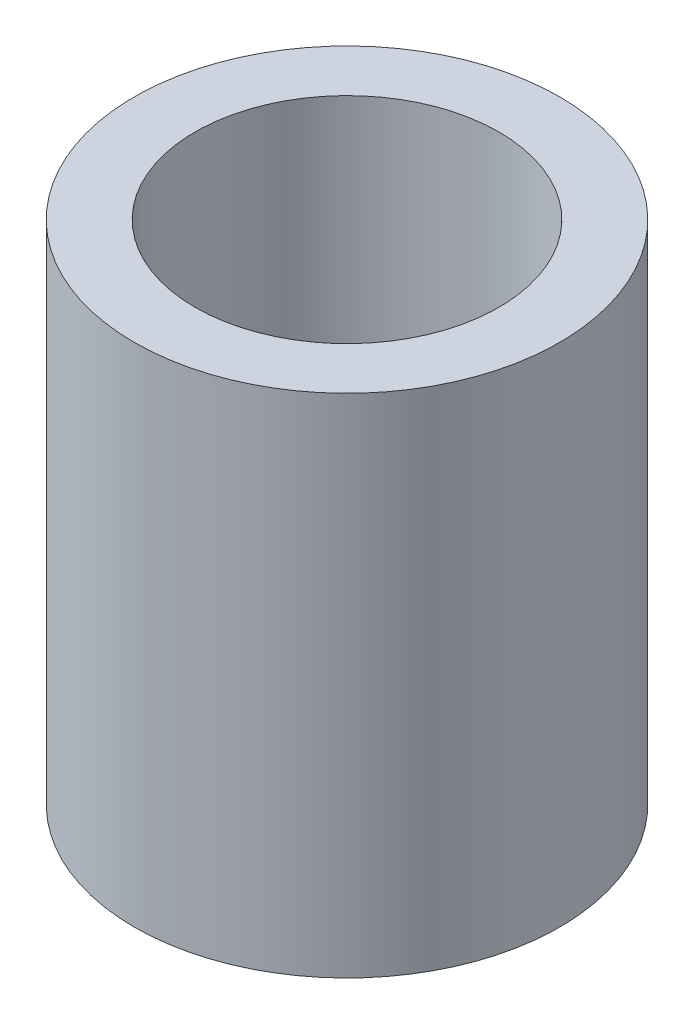
ISO-10303-21;
HEADER;
FILE_DESCRIPTION(('STEP AP214'),'2;1');
FILE_NAME('part.step','',(''),(''),'','','');
FILE_SCHEMA(('AUTOMOTIVE_DESIGN { 1 0 10303 214 1 1 1 1 }'));
ENDSEC;
DATA;
#1=APPLICATION_CONTEXT('core data for automotive mechanical design processes');
#2=APPLICATION_PROTOCOL_DEFINITION('international standard','automotive_design',2000,#1);
#3=PRODUCT_CONTEXT('',#1,'mechanical');
#4=PRODUCT('Part','Part','',(#3));
#5=PRODUCT_RELATED_PRODUCT_CATEGORY('part','',(#4));
#6=PRODUCT_DEFINITION_FORMATION('','',#4);
#7=PRODUCT_DEFINITION_CONTEXT('part definition',#1,'design');
#8=PRODUCT_DEFINITION('design','',#6,#7);
#9=PRODUCT_DEFINITION_SHAPE('','',#8);
#10=(LENGTH_UNIT() NAMED_UNIT(*) SI_UNIT(.MILLI.,.METRE.));
#11=(NAMED_UNIT(*) PLANE_ANGLE_UNIT() SI_UNIT($,.RADIAN.));
#12=(NAMED_UNIT(*) SI_UNIT($,.STERADIAN.) SOLID_ANGLE_UNIT());
#13=UNCERTAINTY_MEASURE_WITH_UNIT(LENGTH_MEASURE(1.E-05),#10,'distance_accuracy_value','');
#14=(GEOMETRIC_REPRESENTATION_CONTEXT(3) GLOBAL_UNCERTAINTY_ASSIGNED_CONTEXT((#13)) GLOBAL_UNIT_ASSIGNED_CONTEXT((#10,
#11,#12)) REPRESENTATION_CONTEXT('',''));
#15=CARTESIAN_POINT('',(0.,0.,0.));
#16=DIRECTION('',(0.,0.,1.));
#17=DIRECTION('',(1.,0.,0.));
#18=AXIS2_PLACEMENT_3D('',#15,#16,#17);
#19=CARTESIAN_POINT('',(0.,5.,0.));
#20=DIRECTION('',(0.,1.,0.));
#21=DIRECTION('',(0.,0.,1.));
#22=AXIS2_PLACEMENT_3D('',#19,#20,#21);
#23=PLANE('',#22);
#24=CARTESIAN_POINT('',(0.,5.,0.));
#25=DIRECTION('',(0.,1.,0.));
#26=DIRECTION('',(0.,0.,1.));
#27=AXIS2_PLACEMENT_3D('',#24,#25,#26);
#28=CIRCLE('',#27,2.1);
#29=CARTESIAN_POINT('',(0.,5.,2.1));
#30=VERTEX_POINT('',#29);
#31=EDGE_CURVE('E10',#30,#30,#28,.T.);
#32=ORIENTED_EDGE('',*,*,#31,.T.);
#33=EDGE_LOOP('',(#32));
#34=FACE_BOUND('',#33,.T.);
#35=CARTESIAN_POINT('',(0.,5.,0.));
#36=DIRECTION('',(0.,1.,0.));
#37=DIRECTION('',(0.,0.,1.));
#38=AXIS2_PLACEMENT_3D('',#35,#36,#37);
#39=CIRCLE('',#38,1.5);
#40=CARTESIAN_POINT('',(0.,5.,1.5));
#41=VERTEX_POINT('',#40);
#42=EDGE_CURVE('E46',#41,#41,#39,.T.);
#43=ORIENTED_EDGE('',*,*,#42,.F.);
#44=EDGE_LOOP('',(#43));
#45=FACE_BOUND('',#44,.T.);
#46=ADVANCED_FACE('F35',(#34,#45),#23,.T.);
#47=CARTESIAN_POINT('',(0.,0.,0.));
#48=DIRECTION('',(0.,1.,0.));
#49=DIRECTION('',(0.,0.,1.));
#50=AXIS2_PLACEMENT_3D('',#47,#48,#49);
#51=PLANE('',#50);
#52=CARTESIAN_POINT('',(0.,0.,0.));
#53=DIRECTION('',(0.,1.,0.));
#54=DIRECTION('',(0.,0.,1.));
#55=AXIS2_PLACEMENT_3D('',#52,#53,#54);
#56=CIRCLE('',#55,2.1);
#57=CARTESIAN_POINT('',(0.,0.,2.1));
#58=VERTEX_POINT('',#57);
#59=EDGE_CURVE('E39',#58,#58,#56,.T.);
#60=ORIENTED_EDGE('',*,*,#59,.F.);
#61=EDGE_LOOP('',(#60));
#62=FACE_BOUND('',#61,.T.);
#63=CARTESIAN_POINT('',(0.,0.,0.));
#64=DIRECTION('',(0.,1.,0.));
#65=DIRECTION('',(0.,0.,1.));
#66=AXIS2_PLACEMENT_3D('',#63,#64,#65);
#67=CIRCLE('',#66,1.5);
#68=CARTESIAN_POINT('',(0.,0.,1.5));
#69=VERTEX_POINT('',#68);
#70=EDGE_CURVE('E48',#69,#69,#67,.T.);
#71=ORIENTED_EDGE('',*,*,#70,.T.);
#72=EDGE_LOOP('',(#71));
#73=FACE_BOUND('',#72,.T.);
#74=ADVANCED_FACE('F58',(#62,#73),#51,.F.);
#75=CARTESIAN_POINT('',(0.,5.,0.));
#76=DIRECTION('',(0.,-1.,0.));
#77=DIRECTION('',(0.,0.,-1.));
#78=AXIS2_PLACEMENT_3D('',#75,#76,#77);
#79=CYLINDRICAL_SURFACE('',#78,2.1);
#80=ORIENTED_EDGE('',*,*,#31,.F.);
#81=EDGE_LOOP('',(#80));
#82=FACE_BOUND('',#81,.T.);
#83=ORIENTED_EDGE('',*,*,#59,.T.);
#84=EDGE_LOOP('',(#83));
#85=FACE_BOUND('',#84,.T.);
#86=ADVANCED_FACE('F37',(#82,#85),#79,.T.);
#87=CARTESIAN_POINT('',(0.,5.,0.));
#88=DIRECTION('',(0.,-1.,0.));
#89=DIRECTION('',(0.,0.,-1.));
#90=AXIS2_PLACEMENT_3D('',#87,#88,#89);
#91=CYLINDRICAL_SURFACE('',#90,1.5);
#92=ORIENTED_EDGE('',*,*,#42,.T.);
#93=EDGE_LOOP('',(#92));
#94=FACE_BOUND('',#93,.T.);
#95=ORIENTED_EDGE('',*,*,#70,.F.);
#96=EDGE_LOOP('',(#95));
#97=FACE_BOUND('',#96,.T.);
#98=ADVANCED_FACE('F54',(#94,#97),#91,.F.);
#99=CLOSED_SHELL('',(#46,#74,#86,#98));
#100=MANIFOLD_SOLID_BREP('B2',#99);
#101=ADVANCED_BREP_SHAPE_REPRESENTATION('',(#18,#100),#14);
#102=SHAPE_DEFINITION_REPRESENTATION(#9,#101);
ENDSEC;
END-ISO-10303-21;
